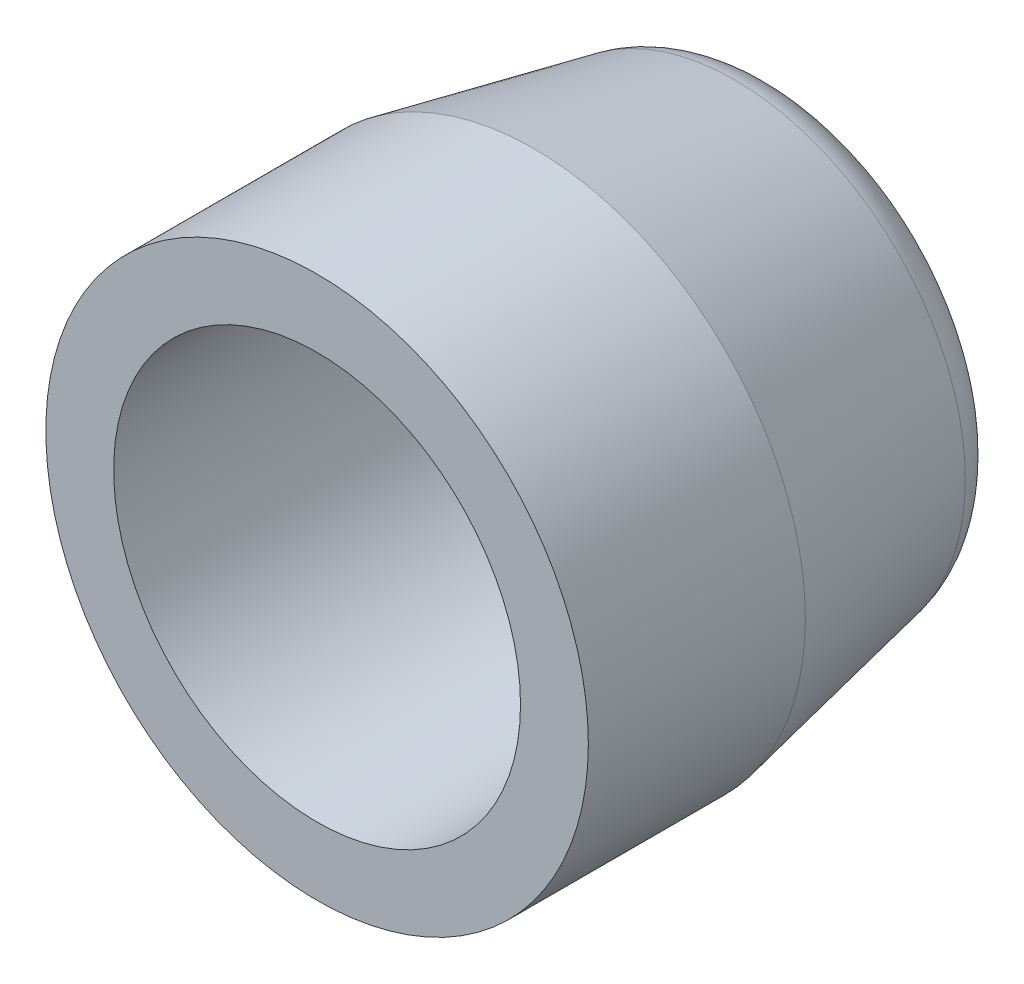
ISO-10303-21;
HEADER;
FILE_DESCRIPTION(('STEP AP214'),'2;1');
FILE_NAME('part.step','',(''),(''),'','','');
FILE_SCHEMA(('AUTOMOTIVE_DESIGN { 1 0 10303 214 1 1 1 1 }'));
ENDSEC;
DATA;
#1=APPLICATION_CONTEXT('core data for automotive mechanical design processes');
#2=APPLICATION_PROTOCOL_DEFINITION('international standard','automotive_design',2000,#1);
#3=PRODUCT_CONTEXT('',#1,'mechanical');
#4=PRODUCT('Part','Part','',(#3));
#5=PRODUCT_RELATED_PRODUCT_CATEGORY('part','',(#4));
#6=PRODUCT_DEFINITION_FORMATION('','',#4);
#7=PRODUCT_DEFINITION_CONTEXT('part definition',#1,'design');
#8=PRODUCT_DEFINITION('design','',#6,#7);
#9=PRODUCT_DEFINITION_SHAPE('','',#8);
#10=(LENGTH_UNIT() NAMED_UNIT(*) SI_UNIT(.MILLI.,.METRE.));
#11=(NAMED_UNIT(*) PLANE_ANGLE_UNIT() SI_UNIT($,.RADIAN.));
#12=(NAMED_UNIT(*) SI_UNIT($,.STERADIAN.) SOLID_ANGLE_UNIT());
#13=UNCERTAINTY_MEASURE_WITH_UNIT(LENGTH_MEASURE(1.E-05),#10,'distance_accuracy_value','');
#14=(GEOMETRIC_REPRESENTATION_CONTEXT(3) GLOBAL_UNCERTAINTY_ASSIGNED_CONTEXT((#13)) GLOBAL_UNIT_ASSIGNED_CONTEXT((#10,
#11,#12)) REPRESENTATION_CONTEXT('',''));
#15=CARTESIAN_POINT('',(0.,0.,0.));
#16=DIRECTION('',(0.,0.,1.));
#17=DIRECTION('',(1.,0.,0.));
#18=AXIS2_PLACEMENT_3D('',#15,#16,#17);
#19=CARTESIAN_POINT('',(0.,0.,-4.));
#20=DIRECTION('',(0.,0.,1.));
#21=DIRECTION('',(1.,0.,0.));
#22=AXIS2_PLACEMENT_3D('',#19,#20,#21);
#23=CONICAL_SURFACE('',#22,5.,0.200059911814099);
#24=CARTESIAN_POINT('',(0.,0.,-7.69872804800509));
#25=DIRECTION('',(0.,0.,1.));
#26=DIRECTION('',(1.,0.,0.));
#27=AXIS2_PLACEMENT_3D('',#24,#25,#26);
#28=CIRCLE('',#27,4.25);
#29=CARTESIAN_POINT('',(4.25,0.,-7.69872804800509));
#30=VERTEX_POINT('',#29);
#31=EDGE_CURVE('E10',#30,#30,#28,.T.);
#32=ORIENTED_EDGE('',*,*,#31,.T.);
#33=EDGE_LOOP('',(#32));
#34=FACE_BOUND('',#33,.T.);
#35=CARTESIAN_POINT('',(0.,0.,-4.));
#36=DIRECTION('',(0.,0.,1.));
#37=DIRECTION('',(1.,0.,0.));
#38=AXIS2_PLACEMENT_3D('',#35,#36,#37);
#39=CIRCLE('',#38,5.);
#40=CARTESIAN_POINT('',(5.,0.,-4.));
#41=VERTEX_POINT('',#40);
#42=EDGE_CURVE('E69',#41,#41,#39,.T.);
#43=ORIENTED_EDGE('',*,*,#42,.F.);
#44=EDGE_LOOP('',(#43));
#45=FACE_BOUND('',#44,.T.);
#46=ADVANCED_FACE('F41',(#34,#45),#23,.T.);
#47=CARTESIAN_POINT('',(0.,0.,-7.5));
#48=DIRECTION('',(0.,0.,1.));
#49=DIRECTION('',(1.,0.,0.));
#50=AXIS2_PLACEMENT_3D('',#47,#48,#49);
#51=TOROIDAL_SURFACE('',#50,3.26994532655771,0.999999999999999);
#52=CARTESIAN_POINT('',(0.,0.,-8.5));
#53=DIRECTION('',(0.,0.,1.));
#54=DIRECTION('',(1.,0.,0.));
#55=AXIS2_PLACEMENT_3D('',#52,#53,#54);
#56=CIRCLE('',#55,3.26994532655771);
#57=CARTESIAN_POINT('',(3.26994532655771,0.,-8.5));
#58=VERTEX_POINT('',#57);
#59=EDGE_CURVE('E47',#58,#58,#56,.T.);
#60=ORIENTED_EDGE('',*,*,#59,.T.);
#61=EDGE_LOOP('',(#60));
#62=FACE_BOUND('',#61,.T.);
#63=ORIENTED_EDGE('',*,*,#31,.F.);
#64=EDGE_LOOP('',(#63));
#65=FACE_BOUND('',#64,.T.);
#66=ADVANCED_FACE('F77',(#62,#65),#51,.T.);
#67=CARTESIAN_POINT('',(0.,0.,-8.5));
#68=DIRECTION('',(0.,0.,1.));
#69=DIRECTION('',(1.,0.,0.));
#70=AXIS2_PLACEMENT_3D('',#67,#68,#69);
#71=PLANE('',#70);
#72=ORIENTED_EDGE('',*,*,#59,.F.);
#73=EDGE_LOOP('',(#72));
#74=FACE_BOUND('',#73,.T.);
#75=CARTESIAN_POINT('',(0.,0.,-8.5));
#76=DIRECTION('',(0.,0.,1.));
#77=DIRECTION('',(1.,0.,0.));
#78=AXIS2_PLACEMENT_3D('',#75,#76,#77);
#79=CIRCLE('',#78,1.5);
#80=CARTESIAN_POINT('',(1.5,0.,-8.5));
#81=VERTEX_POINT('',#80);
#82=EDGE_CURVE('E51',#81,#81,#79,.T.);
#83=ORIENTED_EDGE('',*,*,#82,.T.);
#84=EDGE_LOOP('',(#83));
#85=FACE_BOUND('',#84,.T.);
#86=ADVANCED_FACE('F81',(#74,#85),#71,.F.);
#87=CARTESIAN_POINT('',(0.,0.,0.));
#88=DIRECTION('',(0.,0.,1.));
#89=DIRECTION('',(1.,0.,0.));
#90=AXIS2_PLACEMENT_3D('',#87,#88,#89);
#91=CYLINDRICAL_SURFACE('',#90,1.5);
#92=ORIENTED_EDGE('',*,*,#82,.F.);
#93=EDGE_LOOP('',(#92));
#94=FACE_BOUND('',#93,.T.);
#95=CARTESIAN_POINT('',(0.,0.,-7.1));
#96=DIRECTION('',(0.,0.,1.));
#97=DIRECTION('',(1.,0.,0.));
#98=AXIS2_PLACEMENT_3D('',#95,#96,#97);
#99=CIRCLE('',#98,1.5);
#100=CARTESIAN_POINT('',(1.5,0.,-7.1));
#101=VERTEX_POINT('',#100);
#102=EDGE_CURVE('E55',#101,#101,#99,.T.);
#103=ORIENTED_EDGE('',*,*,#102,.T.);
#104=EDGE_LOOP('',(#103));
#105=FACE_BOUND('',#104,.T.);
#106=ADVANCED_FACE('F85',(#94,#105),#91,.F.);
#107=CARTESIAN_POINT('',(0.,0.,-7.1));
#108=DIRECTION('',(0.,0.,1.));
#109=DIRECTION('',(1.,0.,0.));
#110=AXIS2_PLACEMENT_3D('',#107,#108,#109);
#111=PLANE('',#110);
#112=CARTESIAN_POINT('',(0.,0.,-7.1));
#113=DIRECTION('',(0.,0.,1.));
#114=DIRECTION('',(1.,0.,0.));
#115=AXIS2_PLACEMENT_3D('',#112,#113,#114);
#116=CIRCLE('',#115,3.75);
#117=CARTESIAN_POINT('',(3.75,0.,-7.1));
#118=VERTEX_POINT('',#117);
#119=EDGE_CURVE('E60',#118,#118,#116,.T.);
#120=ORIENTED_EDGE('',*,*,#119,.T.);
#121=EDGE_LOOP('',(#120));
#122=FACE_BOUND('',#121,.T.);
#123=ORIENTED_EDGE('',*,*,#102,.F.);
#124=EDGE_LOOP('',(#123));
#125=FACE_BOUND('',#124,.T.);
#126=ADVANCED_FACE('F92',(#122,#125),#111,.T.);
#127=CARTESIAN_POINT('',(0.,0.,0.));
#128=DIRECTION('',(0.,0.,1.));
#129=DIRECTION('',(1.,0.,0.));
#130=AXIS2_PLACEMENT_3D('',#127,#128,#129);
#131=CYLINDRICAL_SURFACE('',#130,3.75);
#132=ORIENTED_EDGE('',*,*,#119,.F.);
#133=EDGE_LOOP('',(#132));
#134=FACE_BOUND('',#133,.T.);
#135=CARTESIAN_POINT('',(0.,0.,0.));
#136=DIRECTION('',(0.,0.,1.));
#137=DIRECTION('',(1.,0.,0.));
#138=AXIS2_PLACEMENT_3D('',#135,#136,#137);
#139=CIRCLE('',#138,3.75);
#140=CARTESIAN_POINT('',(3.75,0.,0.));
#141=VERTEX_POINT('',#140);
#142=EDGE_CURVE('E63',#141,#141,#139,.T.);
#143=ORIENTED_EDGE('',*,*,#142,.T.);
#144=EDGE_LOOP('',(#143));
#145=FACE_BOUND('',#144,.T.);
#146=ADVANCED_FACE('F96',(#134,#145),#131,.F.);
#147=CARTESIAN_POINT('',(0.,0.,0.));
#148=DIRECTION('',(0.,0.,1.));
#149=DIRECTION('',(1.,0.,0.));
#150=AXIS2_PLACEMENT_3D('',#147,#148,#149);
#151=PLANE('',#150);
#152=CARTESIAN_POINT('',(0.,0.,0.));
#153=DIRECTION('',(0.,0.,1.));
#154=DIRECTION('',(1.,0.,0.));
#155=AXIS2_PLACEMENT_3D('',#152,#153,#154);
#156=CIRCLE('',#155,5.);
#157=CARTESIAN_POINT('',(5.,0.,0.));
#158=VERTEX_POINT('',#157);
#159=EDGE_CURVE('E66',#158,#158,#156,.T.);
#160=ORIENTED_EDGE('',*,*,#159,.T.);
#161=EDGE_LOOP('',(#160));
#162=FACE_BOUND('',#161,.T.);
#163=ORIENTED_EDGE('',*,*,#142,.F.);
#164=EDGE_LOOP('',(#163));
#165=FACE_BOUND('',#164,.T.);
#166=ADVANCED_FACE('F100',(#162,#165),#151,.T.);
#167=CARTESIAN_POINT('',(0.,0.,0.));
#168=DIRECTION('',(0.,0.,1.));
#169=DIRECTION('',(1.,0.,0.));
#170=AXIS2_PLACEMENT_3D('',#167,#168,#169);
#171=CYLINDRICAL_SURFACE('',#170,5.);
#172=ORIENTED_EDGE('',*,*,#42,.T.);
#173=EDGE_LOOP('',(#172));
#174=FACE_BOUND('',#173,.T.);
#175=ORIENTED_EDGE('',*,*,#159,.F.);
#176=EDGE_LOOP('',(#175));
#177=FACE_BOUND('',#176,.T.);
#178=ADVANCED_FACE('F73',(#174,#177),#171,.T.);
#179=CLOSED_SHELL('',(#46,#66,#86,#106,#126,#146,#166,#178));
#180=MANIFOLD_SOLID_BREP('B2',#179);
#181=ADVANCED_BREP_SHAPE_REPRESENTATION('',(#18,#180),#14);
#182=SHAPE_DEFINITION_REPRESENTATION(#9,#181);
ENDSEC;
END-ISO-10303-21;
